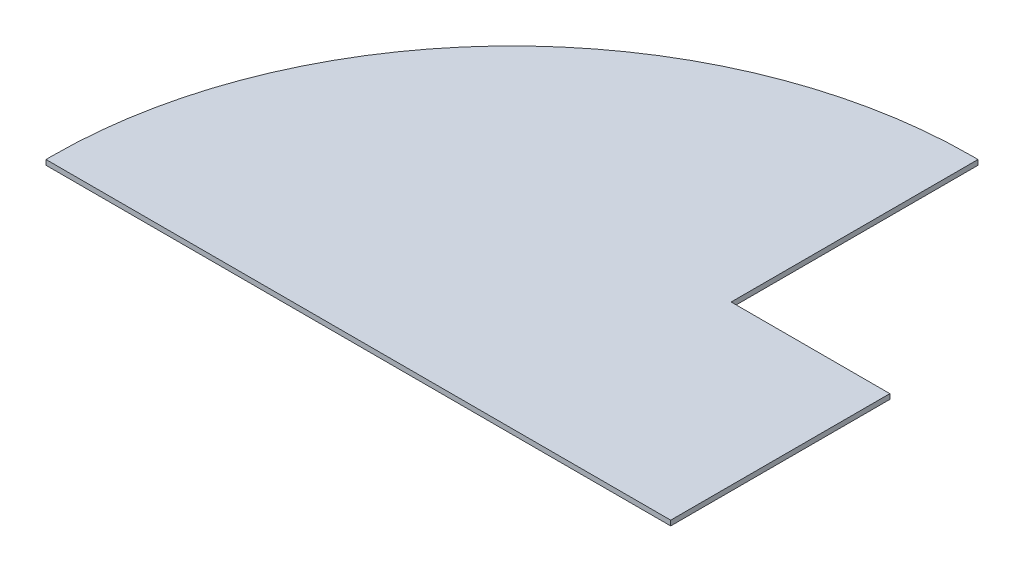
ISO-10303-21;
HEADER;
FILE_DESCRIPTION(('STEP AP214'),'2;1');
FILE_NAME('part.step','',(''),(''),'','','');
FILE_SCHEMA(('AUTOMOTIVE_DESIGN { 1 0 10303 214 1 1 1 1 }'));
ENDSEC;
DATA;
#1=APPLICATION_CONTEXT('core data for automotive mechanical design processes');
#2=APPLICATION_PROTOCOL_DEFINITION('international standard','automotive_design',2000,#1);
#3=PRODUCT_CONTEXT('',#1,'mechanical');
#4=PRODUCT('Part','Part','',(#3));
#5=PRODUCT_RELATED_PRODUCT_CATEGORY('part','',(#4));
#6=PRODUCT_DEFINITION_FORMATION('','',#4);
#7=PRODUCT_DEFINITION_CONTEXT('part definition',#1,'design');
#8=PRODUCT_DEFINITION('design','',#6,#7);
#9=PRODUCT_DEFINITION_SHAPE('','',#8);
#10=(LENGTH_UNIT() NAMED_UNIT(*) SI_UNIT(.MILLI.,.METRE.));
#11=(NAMED_UNIT(*) PLANE_ANGLE_UNIT() SI_UNIT($,.RADIAN.));
#12=(NAMED_UNIT(*) SI_UNIT($,.STERADIAN.) SOLID_ANGLE_UNIT());
#13=UNCERTAINTY_MEASURE_WITH_UNIT(LENGTH_MEASURE(1.E-05),#10,'distance_accuracy_value','');
#14=(GEOMETRIC_REPRESENTATION_CONTEXT(3) GLOBAL_UNCERTAINTY_ASSIGNED_CONTEXT((#13)) GLOBAL_UNIT_ASSIGNED_CONTEXT((#10,
#11,#12)) REPRESENTATION_CONTEXT('',''));
#15=CARTESIAN_POINT('',(0.,0.,0.));
#16=DIRECTION('',(0.,0.,1.));
#17=DIRECTION('',(1.,0.,0.));
#18=AXIS2_PLACEMENT_3D('',#15,#16,#17);
#19=CARTESIAN_POINT('',(8.47024208356758,-0.8,-6.16675548060706));
#20=DIRECTION('',(0.,0.,-1.));
#21=DIRECTION('',(-1.,0.,0.));
#22=AXIS2_PLACEMENT_3D('',#19,#20,#21);
#23=PLANE('',#22);
#24=DIRECTION('',(-1.,0.,0.));
#25=VECTOR('',#24,1.);
#26=CARTESIAN_POINT('',(8.47024208356758,0.,-6.16675548060706));
#27=LINE('',#26,#25);
#28=CARTESIAN_POINT('',(33.6702420835676,0.,-6.16675548060706));
#29=VERTEX_POINT('',#28);
#30=CARTESIAN_POINT('',(8.47024208356758,0.,-6.16675548060706));
#31=VERTEX_POINT('',#30);
#32=EDGE_CURVE('E124',#29,#31,#27,.T.);
#33=ORIENTED_EDGE('',*,*,#32,.F.);
#34=DIRECTION('',(0.,1.,0.));
#35=VECTOR('',#34,1.);
#36=CARTESIAN_POINT('',(33.6702420835676,-0.8,-6.16675548060706));
#37=LINE('',#36,#35);
#38=CARTESIAN_POINT('',(33.6702420835676,-0.8,-6.16675548060706));
#39=VERTEX_POINT('',#38);
#40=EDGE_CURVE('E11',#39,#29,#37,.T.);
#41=ORIENTED_EDGE('',*,*,#40,.F.);
#42=DIRECTION('',(-1.,0.,0.));
#43=VECTOR('',#42,1.);
#44=CARTESIAN_POINT('',(8.47024208356758,-0.8,-6.16675548060706));
#45=LINE('',#44,#43);
#46=CARTESIAN_POINT('',(8.47024208356758,-0.8,-6.16675548060706));
#47=VERTEX_POINT('',#46);
#48=EDGE_CURVE('E141',#39,#47,#45,.T.);
#49=ORIENTED_EDGE('',*,*,#48,.T.);
#50=DIRECTION('',(0.,1.,0.));
#51=VECTOR('',#50,1.);
#52=CARTESIAN_POINT('',(8.47024208356758,-0.8,-6.16675548060706));
#53=LINE('',#52,#51);
#54=EDGE_CURVE('E36',#47,#31,#53,.T.);
#55=ORIENTED_EDGE('',*,*,#54,.T.);
#56=EDGE_LOOP('',(#33,#41,#49,#55));
#57=FACE_BOUND('',#56,.T.);
#58=ADVANCED_FACE('F33',(#57),#23,.T.);
#59=CARTESIAN_POINT('',(33.6702420835676,-0.8,-6.16675548060706));
#60=DIRECTION('',(1.,0.,0.));
#61=DIRECTION('',(0.,0.,-1.));
#62=AXIS2_PLACEMENT_3D('',#59,#60,#61);
#63=PLANE('',#62);
#64=DIRECTION('',(0.,0.,-1.));
#65=VECTOR('',#64,1.);
#66=CARTESIAN_POINT('',(33.6702420835676,0.,-6.16675548060706));
#67=LINE('',#66,#65);
#68=CARTESIAN_POINT('',(33.6702420835676,0.,28.6332445193929));
#69=VERTEX_POINT('',#68);
#70=EDGE_CURVE('E139',#69,#29,#67,.T.);
#71=ORIENTED_EDGE('',*,*,#70,.F.);
#72=DIRECTION('',(0.,1.,0.));
#73=VECTOR('',#72,1.);
#74=CARTESIAN_POINT('',(33.6702420835676,-0.8,28.6332445193929));
#75=LINE('',#74,#73);
#76=CARTESIAN_POINT('',(33.6702420835676,-0.8,28.6332445193929));
#77=VERTEX_POINT('',#76);
#78=EDGE_CURVE('E42',#77,#69,#75,.T.);
#79=ORIENTED_EDGE('',*,*,#78,.F.);
#80=DIRECTION('',(0.,0.,-1.));
#81=VECTOR('',#80,1.);
#82=CARTESIAN_POINT('',(33.6702420835676,-0.8,-6.16675548060706));
#83=LINE('',#82,#81);
#84=EDGE_CURVE('E114',#77,#39,#83,.T.);
#85=ORIENTED_EDGE('',*,*,#84,.T.);
#86=ORIENTED_EDGE('',*,*,#40,.T.);
#87=EDGE_LOOP('',(#71,#79,#85,#86));
#88=FACE_BOUND('',#87,.T.);
#89=ADVANCED_FACE('F151',(#88),#63,.T.);
#90=CARTESIAN_POINT('',(-65.5297579164324,-0.8,28.6332445193929));
#91=DIRECTION('',(0.,0.,1.));
#92=DIRECTION('',(1.,0.,0.));
#93=AXIS2_PLACEMENT_3D('',#90,#91,#92);
#94=PLANE('',#93);
#95=DIRECTION('',(1.,0.,0.));
#96=VECTOR('',#95,1.);
#97=CARTESIAN_POINT('',(-65.5297579164324,0.,28.6332445193929));
#98=LINE('',#97,#96);
#99=CARTESIAN_POINT('',(-65.5297579164324,0.,28.6332445193929));
#100=VERTEX_POINT('',#99);
#101=EDGE_CURVE('E101',#100,#69,#98,.T.);
#102=ORIENTED_EDGE('',*,*,#101,.F.);
#103=DIRECTION('',(0.,1.,0.));
#104=VECTOR('',#103,1.);
#105=CARTESIAN_POINT('',(-65.5297579164324,-0.8,28.6332445193929));
#106=LINE('',#105,#104);
#107=CARTESIAN_POINT('',(-65.5297579164324,-0.8,28.6332445193929));
#108=VERTEX_POINT('',#107);
#109=EDGE_CURVE('E96',#108,#100,#106,.T.);
#110=ORIENTED_EDGE('',*,*,#109,.F.);
#111=DIRECTION('',(1.,0.,0.));
#112=VECTOR('',#111,1.);
#113=CARTESIAN_POINT('',(-65.5297579164324,-0.8,28.6332445193929));
#114=LINE('',#113,#112);
#115=EDGE_CURVE('E99',#108,#77,#114,.T.);
#116=ORIENTED_EDGE('',*,*,#115,.T.);
#117=ORIENTED_EDGE('',*,*,#78,.T.);
#118=EDGE_LOOP('',(#102,#110,#116,#117));
#119=FACE_BOUND('',#118,.T.);
#120=ADVANCED_FACE('F98',(#119),#94,.T.);
#121=CARTESIAN_POINT('',(-65.5297579164324,-0.8,28.6332445193929));
#122=DIRECTION('',(-1.,0.,0.));
#123=DIRECTION('',(0.,0.,1.));
#124=AXIS2_PLACEMENT_3D('',#121,#122,#123);
#125=PLANE('',#124);
#126=DIRECTION('',(0.,0.,1.));
#127=VECTOR('',#126,1.);
#128=CARTESIAN_POINT('',(-65.5297579164324,0.,28.6332445193929));
#129=LINE('',#128,#127);
#130=CARTESIAN_POINT('',(-65.5297579164324,0.,27.6332445193935));
#131=VERTEX_POINT('',#130);
#132=EDGE_CURVE('E136',#131,#100,#129,.T.);
#133=ORIENTED_EDGE('',*,*,#132,.F.);
#134=DIRECTION('',(0.,1.,0.));
#135=VECTOR('',#134,1.);
#136=CARTESIAN_POINT('',(-65.5297579164324,-0.8,27.6332445193935));
#137=LINE('',#136,#135);
#138=CARTESIAN_POINT('',(-65.5297579164324,-0.8,27.6332445193935));
#139=VERTEX_POINT('',#138);
#140=EDGE_CURVE('E106',#139,#131,#137,.T.);
#141=ORIENTED_EDGE('',*,*,#140,.F.);
#142=DIRECTION('',(0.,0.,1.));
#143=VECTOR('',#142,1.);
#144=CARTESIAN_POINT('',(-65.5297579164324,-0.8,28.6332445193929));
#145=LINE('',#144,#143);
#146=EDGE_CURVE('E112',#139,#108,#145,.T.);
#147=ORIENTED_EDGE('',*,*,#146,.T.);
#148=ORIENTED_EDGE('',*,*,#109,.T.);
#149=EDGE_LOOP('',(#133,#141,#147,#148));
#150=FACE_BOUND('',#149,.T.);
#151=ADVANCED_FACE('F116',(#150),#125,.T.);
#152=CARTESIAN_POINT('',(7.47024208356757,-0.8,27.6332445193929));
#153=DIRECTION('',(0.,1.,0.));
#154=DIRECTION('',(0.,0.,1.));
#155=AXIS2_PLACEMENT_3D('',#152,#153,#154);
#156=CYLINDRICAL_SURFACE('',#155,73.);
#157=CARTESIAN_POINT('',(7.47024208356757,0.,27.6332445193929));
#158=DIRECTION('',(0.,1.,0.));
#159=DIRECTION('',(0.,0.,-1.));
#160=AXIS2_PLACEMENT_3D('',#157,#158,#159);
#161=CIRCLE('',#160,73.);
#162=CARTESIAN_POINT('',(7.47024208356808,0.,-45.3667554806071));
#163=VERTEX_POINT('',#162);
#164=EDGE_CURVE('E133',#163,#131,#161,.T.);
#165=ORIENTED_EDGE('',*,*,#164,.F.);
#166=DIRECTION('',(0.,1.,0.));
#167=VECTOR('',#166,1.);
#168=CARTESIAN_POINT('',(7.47024208356808,-0.8,-45.3667554806071));
#169=LINE('',#168,#167);
#170=CARTESIAN_POINT('',(7.47024208356808,-0.8,-45.3667554806071));
#171=VERTEX_POINT('',#170);
#172=EDGE_CURVE('E145',#171,#163,#169,.T.);
#173=ORIENTED_EDGE('',*,*,#172,.F.);
#174=CARTESIAN_POINT('',(7.47024208356757,-0.8,27.6332445193929));
#175=DIRECTION('',(0.,1.,0.));
#176=DIRECTION('',(0.,0.,-1.));
#177=AXIS2_PLACEMENT_3D('',#174,#175,#176);
#178=CIRCLE('',#177,73.);
#179=EDGE_CURVE('E117',#171,#139,#178,.T.);
#180=ORIENTED_EDGE('',*,*,#179,.T.);
#181=ORIENTED_EDGE('',*,*,#140,.T.);
#182=EDGE_LOOP('',(#165,#173,#180,#181));
#183=FACE_BOUND('',#182,.T.);
#184=ADVANCED_FACE('F164',(#183),#156,.T.);
#185=CARTESIAN_POINT('',(7.47024208356808,-0.8,-45.3667554806071));
#186=DIRECTION('',(0.,0.,-1.));
#187=DIRECTION('',(-1.,0.,0.));
#188=AXIS2_PLACEMENT_3D('',#185,#186,#187);
#189=PLANE('',#188);
#190=DIRECTION('',(-1.,0.,0.));
#191=VECTOR('',#190,1.);
#192=CARTESIAN_POINT('',(7.47024208356808,0.,-45.3667554806071));
#193=LINE('',#192,#191);
#194=CARTESIAN_POINT('',(8.47024208356757,0.,-45.3667554806071));
#195=VERTEX_POINT('',#194);
#196=EDGE_CURVE('E130',#195,#163,#193,.T.);
#197=ORIENTED_EDGE('',*,*,#196,.F.);
#198=DIRECTION('',(0.,1.,0.));
#199=VECTOR('',#198,1.);
#200=CARTESIAN_POINT('',(8.47024208356757,-0.8,-45.3667554806071));
#201=LINE('',#200,#199);
#202=CARTESIAN_POINT('',(8.47024208356757,-0.8,-45.3667554806071));
#203=VERTEX_POINT('',#202);
#204=EDGE_CURVE('E146',#203,#195,#201,.T.);
#205=ORIENTED_EDGE('',*,*,#204,.F.);
#206=DIRECTION('',(-1.,0.,0.));
#207=VECTOR('',#206,1.);
#208=CARTESIAN_POINT('',(7.47024208356808,-0.8,-45.3667554806071));
#209=LINE('',#208,#207);
#210=EDGE_CURVE('E119',#203,#171,#209,.T.);
#211=ORIENTED_EDGE('',*,*,#210,.T.);
#212=ORIENTED_EDGE('',*,*,#172,.T.);
#213=EDGE_LOOP('',(#197,#205,#211,#212));
#214=FACE_BOUND('',#213,.T.);
#215=ADVANCED_FACE('F167',(#214),#189,.T.);
#216=CARTESIAN_POINT('',(8.47024208356757,-0.8,-45.3667554806071));
#217=DIRECTION('',(1.,0.,0.));
#218=DIRECTION('',(0.,0.,-1.));
#219=AXIS2_PLACEMENT_3D('',#216,#217,#218);
#220=PLANE('',#219);
#221=DIRECTION('',(0.,0.,-1.));
#222=VECTOR('',#221,1.);
#223=CARTESIAN_POINT('',(8.47024208356757,0.,-45.3667554806071));
#224=LINE('',#223,#222);
#225=EDGE_CURVE('E127',#31,#195,#224,.T.);
#226=ORIENTED_EDGE('',*,*,#225,.F.);
#227=ORIENTED_EDGE('',*,*,#54,.F.);
#228=DIRECTION('',(0.,0.,-1.));
#229=VECTOR('',#228,1.);
#230=CARTESIAN_POINT('',(8.47024208356757,-0.8,-45.3667554806071));
#231=LINE('',#230,#229);
#232=EDGE_CURVE('E247',#47,#203,#231,.T.);
#233=ORIENTED_EDGE('',*,*,#232,.T.);
#234=ORIENTED_EDGE('',*,*,#204,.T.);
#235=EDGE_LOOP('',(#226,#227,#233,#234));
#236=FACE_BOUND('',#235,.T.);
#237=ADVANCED_FACE('F148',(#236),#220,.T.);
#238=CARTESIAN_POINT('',(7.47024208356757,-0.8,27.6332445193929));
#239=DIRECTION('',(0.,-1.,0.));
#240=DIRECTION('',(0.,0.,-1.));
#241=AXIS2_PLACEMENT_3D('',#238,#239,#240);
#242=PLANE('',#241);
#243=ORIENTED_EDGE('',*,*,#48,.F.);
#244=ORIENTED_EDGE('',*,*,#84,.F.);
#245=ORIENTED_EDGE('',*,*,#115,.F.);
#246=ORIENTED_EDGE('',*,*,#146,.F.);
#247=ORIENTED_EDGE('',*,*,#179,.F.);
#248=ORIENTED_EDGE('',*,*,#210,.F.);
#249=ORIENTED_EDGE('',*,*,#232,.F.);
#250=EDGE_LOOP('',(#243,#244,#245,#246,#247,#248,#249));
#251=FACE_BOUND('',#250,.T.);
#252=ADVANCED_FACE('F110',(#251),#242,.T.);
#253=CARTESIAN_POINT('',(7.47024208356757,0.,27.6332445193929));
#254=DIRECTION('',(0.,-1.,0.));
#255=DIRECTION('',(0.,0.,-1.));
#256=AXIS2_PLACEMENT_3D('',#253,#254,#255);
#257=PLANE('',#256);
#258=ORIENTED_EDGE('',*,*,#32,.T.);
#259=ORIENTED_EDGE('',*,*,#225,.T.);
#260=ORIENTED_EDGE('',*,*,#196,.T.);
#261=ORIENTED_EDGE('',*,*,#164,.T.);
#262=ORIENTED_EDGE('',*,*,#132,.T.);
#263=ORIENTED_EDGE('',*,*,#101,.T.);
#264=ORIENTED_EDGE('',*,*,#70,.T.);
#265=EDGE_LOOP('',(#258,#259,#260,#261,#262,#263,#264));
#266=FACE_BOUND('',#265,.T.);
#267=ADVANCED_FACE('F150',(#266),#257,.F.);
#268=CLOSED_SHELL('',(#58,#89,#120,#151,#184,#215,#237,#252,#267));
#269=MANIFOLD_SOLID_BREP('B2',#268);
#270=ADVANCED_BREP_SHAPE_REPRESENTATION('',(#18,#269),#14);
#271=SHAPE_DEFINITION_REPRESENTATION(#9,#270);
ENDSEC;
END-ISO-10303-21;
